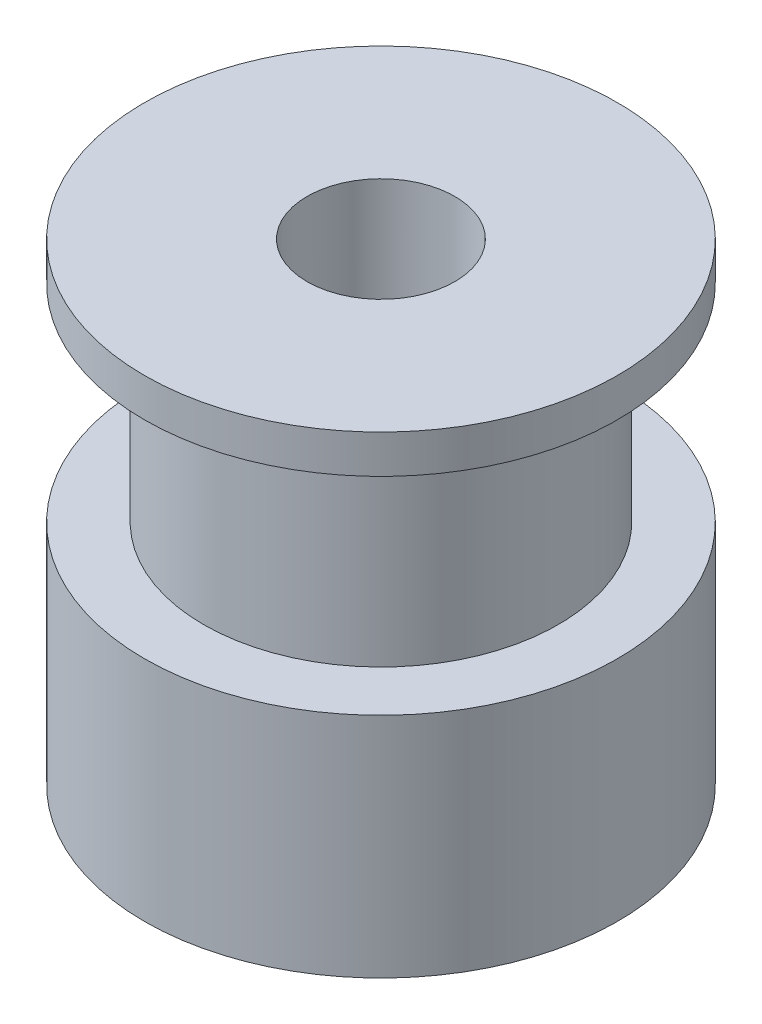
ISO-10303-21;
HEADER;
FILE_DESCRIPTION(('STEP AP214'),'2;1');
FILE_NAME('part.step','',(''),(''),'','','');
FILE_SCHEMA(('AUTOMOTIVE_DESIGN { 1 0 10303 214 1 1 1 1 }'));
ENDSEC;
DATA;
#1=APPLICATION_CONTEXT('core data for automotive mechanical design processes');
#2=APPLICATION_PROTOCOL_DEFINITION('international standard','automotive_design',2000,#1);
#3=PRODUCT_CONTEXT('',#1,'mechanical');
#4=PRODUCT('Part','Part','',(#3));
#5=PRODUCT_RELATED_PRODUCT_CATEGORY('part','',(#4));
#6=PRODUCT_DEFINITION_FORMATION('','',#4);
#7=PRODUCT_DEFINITION_CONTEXT('part definition',#1,'design');
#8=PRODUCT_DEFINITION('design','',#6,#7);
#9=PRODUCT_DEFINITION_SHAPE('','',#8);
#10=(LENGTH_UNIT() NAMED_UNIT(*) SI_UNIT(.MILLI.,.METRE.));
#11=(NAMED_UNIT(*) PLANE_ANGLE_UNIT() SI_UNIT($,.RADIAN.));
#12=(NAMED_UNIT(*) SI_UNIT($,.STERADIAN.) SOLID_ANGLE_UNIT());
#13=UNCERTAINTY_MEASURE_WITH_UNIT(LENGTH_MEASURE(1.E-05),#10,'distance_accuracy_value','');
#14=(GEOMETRIC_REPRESENTATION_CONTEXT(3) GLOBAL_UNCERTAINTY_ASSIGNED_CONTEXT((#13)) GLOBAL_UNIT_ASSIGNED_CONTEXT((#10,
#11,#12)) REPRESENTATION_CONTEXT('',''));
#15=CARTESIAN_POINT('',(0.,0.,0.));
#16=DIRECTION('',(0.,0.,1.));
#17=DIRECTION('',(1.,0.,0.));
#18=AXIS2_PLACEMENT_3D('',#15,#16,#17);
#19=CARTESIAN_POINT('',(0.,16.,0.));
#20=DIRECTION('',(0.,-1.,0.));
#21=DIRECTION('',(0.,0.,-1.));
#22=AXIS2_PLACEMENT_3D('',#19,#20,#21);
#23=CYLINDRICAL_SURFACE('',#22,8.);
#24=CARTESIAN_POINT('',(0.,5.25,-8.));
#25=CARTESIAN_POINT('',(-0.0862000090560729,5.24999676493766,-7.99999842280321));
#26=CARTESIAN_POINT('',(-0.172441514582273,5.24278495234733,-7.99859244950264));
#27=CARTESIAN_POINT('',(-0.342490617447966,5.21414895522089,-7.99311930778483));
#28=CARTESIAN_POINT('',(-0.426296161166576,5.19271312234083,-7.98904995831119));
#29=CARTESIAN_POINT('',(-0.58898979371781,5.13631307059479,-7.97870487543911));
#30=CARTESIAN_POINT('',(-0.667882377412848,5.10136143489223,-7.97243119476004));
#31=CARTESIAN_POINT('',(-0.818677267895579,5.01895847656759,-7.95836101466986));
#32=CARTESIAN_POINT('',(-0.890580066100288,4.97150803354579,-7.95056462242915));
#33=CARTESIAN_POINT('',(-1.02627735016224,4.86481267512939,-7.93419720784637));
#34=CARTESIAN_POINT('',(-1.08996986367006,4.80543925724322,-7.92561835612107));
#35=CARTESIAN_POINT('',(-1.20655602201014,4.6768596781906,-7.90871045383984));
#36=CARTESIAN_POINT('',(-1.25944885837716,4.60765278154584,-7.90038142202523));
#37=CARTESIAN_POINT('',(-1.35336324284205,4.46064378847068,-7.88483993293564));
#38=CARTESIAN_POINT('',(-1.39428014474202,4.38277368025028,-7.87763756031106));
#39=CARTESIAN_POINT('',(-1.46241103269185,4.22110152803017,-7.86527562393696));
#40=CARTESIAN_POINT('',(-1.48962628469253,4.1373000328716,-7.86011587147092));
#41=CARTESIAN_POINT('',(-1.52925220095506,3.96723801759727,-7.85250239060556));
#42=CARTESIAN_POINT('',(-1.54184123479366,3.88102054678682,-7.8500160874707));
#43=CARTESIAN_POINT('',(-1.55241119677996,3.70766408421109,-7.84793288411762));
#44=CARTESIAN_POINT('',(-1.55039352505241,3.62052518156913,-7.84833570696241));
#45=CARTESIAN_POINT('',(-1.53195177741558,3.44909792062467,-7.85195561402893));
#46=CARTESIAN_POINT('',(-1.51573133777978,3.36478669088638,-7.85513291659775));
#47=CARTESIAN_POINT('',(-1.46966555159002,3.20010528434397,-7.8638812199749));
#48=CARTESIAN_POINT('',(-1.43981959064031,3.119735285437,-7.86945232872297));
#49=CARTESIAN_POINT('',(-1.36715315209459,2.96462634241139,-7.88240165698288));
#50=CARTESIAN_POINT('',(-1.32425119437669,2.88992655226814,-7.88979116772949));
#51=CARTESIAN_POINT('',(-1.22674814971844,2.74870967304282,-7.90553732992767));
#52=CARTESIAN_POINT('',(-1.17214579787343,2.68219346989573,-7.9138940859011));
#53=CARTESIAN_POINT('',(-1.05169775923755,2.55805610673058,-7.93080599268302));
#54=CARTESIAN_POINT('',(-0.985678079341828,2.5006037678194,-7.93936211336833));
#55=CARTESIAN_POINT('',(-0.844849674944133,2.39756327596816,-7.95557947642291));
#56=CARTESIAN_POINT('',(-0.770040850625422,2.35197525778797,-7.96324070862712));
#57=CARTESIAN_POINT('',(-0.613575982254031,2.27392948945622,-7.97682216610372));
#58=CARTESIAN_POINT('',(-0.531910527300557,2.2414901539487,-7.98273994653887));
#59=CARTESIAN_POINT('',(-0.364149126216119,2.19083784635154,-7.99214900770227));
#60=CARTESIAN_POINT('',(-0.278053684371384,2.17262325879402,-7.99564056396557));
#61=CARTESIAN_POINT('',(-0.105327839677998,2.15117445702254,-7.99976566694373));
#62=CARTESIAN_POINT('',(-0.0187271634665335,2.14770906909094,-8.0004433137256));
#63=CARTESIAN_POINT('',(0.153815986945086,2.15523571508789,-7.99898639516866));
#64=CARTESIAN_POINT('',(0.239758495532299,2.16622698844903,-7.99685197777301));
#65=CARTESIAN_POINT('',(0.407806296409149,2.20216282211516,-7.99003828417804));
#66=CARTESIAN_POINT('',(0.489937723225352,2.22698959992518,-7.9853804987691));
#67=CARTESIAN_POINT('',(0.648872205621938,2.28976362843683,-7.97404029109996));
#68=CARTESIAN_POINT('',(0.725674880192193,2.32771181617161,-7.96735772424919));
#69=CARTESIAN_POINT('',(0.872752578183329,2.41615741881622,-7.95259926490459));
#70=CARTESIAN_POINT('',(0.942941710588083,2.46679506766572,-7.94450813353156));
#71=CARTESIAN_POINT('',(1.07390931417536,2.57899339889182,-7.92786761642387));
#72=CARTESIAN_POINT('',(1.13468684159778,2.64055517537205,-7.91931818484816));
#73=CARTESIAN_POINT('',(1.24599121245434,2.77390372044563,-7.90257717759425));
#74=CARTESIAN_POINT('',(1.29635982413073,2.84582356552242,-7.89439242829045));
#75=CARTESIAN_POINT('',(1.38430167523511,2.99723907995786,-7.87944838275179));
#76=CARTESIAN_POINT('',(1.4218754090806,3.07673445643215,-7.87268903144079));
#77=CARTESIAN_POINT('',(1.48294066253224,3.24065582775884,-7.86141544092826));
#78=CARTESIAN_POINT('',(1.50650270327786,3.32505474320863,-7.85688997843682));
#79=CARTESIAN_POINT('',(1.53909150160866,3.49671006272617,-7.85057181400503));
#80=CARTESIAN_POINT('',(1.54812002396802,3.58396611854436,-7.84877878027308));
#81=CARTESIAN_POINT('',(1.55132334850363,3.75727208165829,-7.84814610403893));
#82=CARTESIAN_POINT('',(1.5457479550327,3.8433172885347,-7.84925679188612));
#83=CARTESIAN_POINT('',(1.52045079539906,4.01321882488566,-7.85419586161266));
#84=CARTESIAN_POINT('',(1.50072912771435,4.09707516959355,-7.85802422457316));
#85=CARTESIAN_POINT('',(1.44780764189631,4.26007212648241,-7.867945727974));
#86=CARTESIAN_POINT('',(1.41463664120813,4.33922240899543,-7.87403402378802));
#87=CARTESIAN_POINT('',(1.33578606149655,4.49087372647452,-7.88779248725542));
#88=CARTESIAN_POINT('',(1.29010551674906,4.5633742475087,-7.89546277702584));
#89=CARTESIAN_POINT('',(1.18667159674349,4.70091569366497,-7.91167407868071));
#90=CARTESIAN_POINT('',(1.12873710362045,4.76581903052023,-7.92022703770621));
#91=CARTESIAN_POINT('',(1.00281570181795,4.88506582611932,-7.93715240007839));
#92=CARTESIAN_POINT('',(0.934826487245946,4.93940685593038,-7.94552476150182));
#93=CARTESIAN_POINT('',(0.789933072815975,5.03648234853805,-7.96124124716936));
#94=CARTESIAN_POINT('',(0.712948687376799,5.07909893576057,-7.96857459292986));
#95=CARTESIAN_POINT('',(0.552792962431646,5.15072404396555,-7.98128114701078));
#96=CARTESIAN_POINT('',(0.469627401220559,5.17974509348505,-7.98665615895217));
#97=CARTESIAN_POINT('',(0.321871061162894,5.21759630966608,-7.99376993370221));
#98=CARTESIAN_POINT('',(0.258133187842328,5.22972648752207,-7.99609278018456));
#99=CARTESIAN_POINT('',(0.129604676449405,5.24592943416533,-7.99920838449221));
#100=CARTESIAN_POINT('',(0.0648140684162283,5.25000243245394,-8.00000118589942));
#101=CARTESIAN_POINT('',(0.,5.25,-8.));
#102=B_SPLINE_CURVE_WITH_KNOTS('',3,(#24,#25,#26,#27,#28,#29,#30,#31,#32,#33,#34,#35,#36,#37,
#38,#39,#40,#41,#42,#43,#44,#45,#46,#47,#48,#49,#50,#51,#52,#53,#54,#55,#56,#57,#58,#59,#60,#61,
#62,#63,#64,#65,#66,#67,#68,#69,#70,#71,#72,#73,#74,#75,#76,#77,#78,#79,#80,#81,#82,#83,#84,#85,
#86,#87,#88,#89,#90,#91,#92,#93,#94,#95,#96,#97,#98,#99,#100,#101),.UNSPECIFIED.,.T.,.F.,(4,2,2,
2,2,2,2,2,2,2,2,2,2,2,2,2,2,2,2,2,2,2,2,2,2,2,2,2,2,2,2,2,2,2,2,2,2,2,4),(0.,0.258362958819541,
0.516937757947956,0.775272402208297,1.03358887109089,1.29485526419773,1.55614120857562,
1.81964642084703,2.08312728233678,2.34336004904479,2.6035678714891,2.86010487745127,
3.11665345220478,3.3748371276435,3.63304872886352,3.89561245181341,4.15817915694069,
4.42111232492289,4.68401562792029,4.94278274421266,5.20153624726778,5.45811989342286,
5.71472186665191,5.97429534799387,6.23389484154964,6.49718968196383,6.76047434702859,
7.02242242662094,7.2843386960156,7.54180418298674,7.79926787765263,8.05618280428258,
8.31311757007748,8.57415474091679,8.83525186963594,9.09888533019473,9.36227536746884,
9.55654485391842,9.75080880670125),.UNSPECIFIED.);
#103=CARTESIAN_POINT('',(0.,5.25,-8.));
#104=VERTEX_POINT('',#103);
#105=EDGE_CURVE('E60',#104,#104,#102,.T.);
#106=ORIENTED_EDGE('',*,*,#105,.T.);
#107=EDGE_LOOP('',(#106));
#108=FACE_BOUND('',#107,.T.);
#109=CARTESIAN_POINT('',(-7.84840748177616,3.7,1.55));
#110=CARTESIAN_POINT('',(-7.84840917479428,3.61381710885319,1.54999675153501));
#111=CARTESIAN_POINT('',(-7.84984246006417,3.52759268456474,1.54278770606264));
#112=CARTESIAN_POINT('',(-7.85541296965903,3.35757905066934,1.51416369588475));
#113=CARTESIAN_POINT('',(-7.85955242355985,3.27379190861179,1.49273701724449));
#114=CARTESIAN_POINT('',(-7.87004925058474,3.11113724367693,1.43636372934191));
#115=CARTESIAN_POINT('',(-7.876404488281,3.03226507003024,1.40143013364525));
#116=CARTESIAN_POINT('',(-7.89061427460669,2.88150457537131,1.31906969778675));
#117=CARTESIAN_POINT('',(-7.89846872268518,2.80961578647624,1.27164369540043));
#118=CARTESIAN_POINT('',(-7.91490844635351,2.6739035056575,1.16497337071828));
#119=CARTESIAN_POINT('',(-7.92350130996113,2.61018623275839,1.10559505882221));
#120=CARTESIAN_POINT('',(-7.94038276237089,2.49355205350519,0.976995189429632));
#121=CARTESIAN_POINT('',(-7.94867133050778,2.4406358795649,0.907772964965019));
#122=CARTESIAN_POINT('',(-7.96409185638153,2.34669642213338,0.760749728565109));
#123=CARTESIAN_POINT('',(-7.9712138273046,2.30577367820002,0.682883340378193));
#124=CARTESIAN_POINT('',(-7.98341362003513,2.23763097409406,0.521219238216924));
#125=CARTESIAN_POINT('',(-7.98849162132962,2.21040981069243,0.437422045804264));
#126=CARTESIAN_POINT('',(-7.99597772018769,2.17077252082889,0.267376556287115));
#127=CARTESIAN_POINT('',(-7.99841811077838,2.15817718064698,0.181171478825116));
#128=CARTESIAN_POINT('',(-8.00046543898589,2.14759030731567,0.0078395306383784));
#129=CARTESIAN_POINT('',(-8.00007263352152,2.14959744998963,-0.0792872557888458));
#130=CARTESIAN_POINT('',(-7.99652295935206,2.16802186946111,-0.250759179993092));
#131=CARTESIAN_POINT('',(-7.99340311295795,2.18424614186176,-0.335125933339361));
#132=CARTESIAN_POINT('',(-7.98479153905603,2.23033858777597,-0.499916379098675));
#133=CARTESIAN_POINT('',(-7.9792997208631,2.26020728294496,-0.58033992062412));
#134=CARTESIAN_POINT('',(-7.96649981100649,2.33292209527985,-0.735516295161441));
#135=CARTESIAN_POINT('',(-7.95918107415875,2.37584460699432,-0.810232416142011));
#136=CARTESIAN_POINT('',(-7.94353544535097,2.47339223335338,-0.951473377606903));
#137=CARTESIAN_POINT('',(-7.93520844425002,2.52801861539241,-1.01799732974407));
#138=CARTESIAN_POINT('',(-7.918306541966,2.64848456960064,-1.14211004187946));
#139=CARTESIAN_POINT('',(-7.90972981400609,2.71449302628265,-1.19953474929202));
#140=CARTESIAN_POINT('',(-7.89342488450323,2.85528883907341,-1.30252471835069));
#141=CARTESIAN_POINT('',(-7.88569669710255,2.93007634145586,-1.34808978235445));
#142=CARTESIAN_POINT('',(-7.87196073542997,3.08653371042869,-1.42611862268724));
#143=CARTESIAN_POINT('',(-7.86595627357848,3.16821644286062,-1.45855722269684));
#144=CARTESIAN_POINT('',(-7.85639724526608,3.33601564307211,-1.50920284925151));
#145=CARTESIAN_POINT('',(-7.85284238080886,3.42213157017819,-1.52741160690931));
#146=CARTESIAN_POINT('',(-7.84864436792988,3.59486959474718,-1.54883836082157));
#147=CARTESIAN_POINT('',(-7.84795532864622,3.68146129843951,-1.55229264697998));
#148=CARTESIAN_POINT('',(-7.84944399184972,3.85398390799386,-1.54474700341671));
#149=CARTESIAN_POINT('',(-7.85162154238006,3.93991484863979,-1.53374783986684));
#150=CARTESIAN_POINT('',(-7.85855517055887,4.10789129001674,-1.49781079738529));
#151=CARTESIAN_POINT('',(-7.86328810516769,4.1899645840678,-1.47299796126197));
#152=CARTESIAN_POINT('',(-7.87477910573104,4.34878891282538,-1.4102710989445));
#153=CARTESIAN_POINT('',(-7.88153732966491,4.42553953177011,-1.37235605069857));
#154=CARTESIAN_POINT('',(-7.89642123891477,4.57257735252873,-1.28396161175264));
#155=CARTESIAN_POINT('',(-7.90456269734265,4.64277361099191,-1.23333365024262));
#156=CARTESIAN_POINT('',(-7.92125191031692,4.77376004721999,-1.12114973376264));
#157=CARTESIAN_POINT('',(-7.92979970393077,4.83454931814071,-1.05959272644712));
#158=CARTESIAN_POINT('',(-7.94648666010914,4.94588542009488,-0.9262400837038));
#159=CARTESIAN_POINT('',(-7.9546182074806,4.99627291639543,-0.854310314560684));
#160=CARTESIAN_POINT('',(-7.96942624259837,5.08424786235766,-0.702869300885619));
#161=CARTESIAN_POINT('',(-7.97610278894229,5.12183582753241,-0.623358361857509));
#162=CARTESIAN_POINT('',(-7.9872159211584,5.18290929219913,-0.45944172661069));
#163=CARTESIAN_POINT('',(-7.99166465460796,5.2064714062558,-0.375065436031682));
#164=CARTESIAN_POINT('',(-7.9978728695116,5.23906799321239,-0.203458346295077));
#165=CARTESIAN_POINT('',(-7.99963265402342,5.24810410327028,-0.116227869950291));
#166=CARTESIAN_POINT('',(-8.00025810359313,5.2513320219734,0.0570864432622315));
#167=CARTESIAN_POINT('',(-7.99917058136277,5.2457639362274,0.14316573047771));
#168=CARTESIAN_POINT('',(-7.99432145369819,5.22046949834751,0.313137375692122));
#169=CARTESIAN_POINT('',(-7.99055987773605,5.20074330225721,0.397029757783468));
#170=CARTESIAN_POINT('',(-7.98078593726139,5.14779653382766,0.560108090189464));
#171=CARTESIAN_POINT('',(-7.97477810886306,5.11460314590338,0.639303155389725));
#172=CARTESIAN_POINT('',(-7.96116030489722,5.03569376971635,0.791034873243722));
#173=CARTESIAN_POINT('',(-7.95355021238711,4.98997686734092,0.863571039336852));
#174=CARTESIAN_POINT('',(-7.9374200715008,4.88649985414121,1.00111787201507));
#175=CARTESIAN_POINT('',(-7.92888794058911,4.82856710073675,1.06599725682603));
#176=CARTESIAN_POINT('',(-7.91194936427255,4.70265942754123,1.18519653435066));
#177=CARTESIAN_POINT('',(-7.90354294899311,4.63468214191662,1.23951393235294));
#178=CARTESIAN_POINT('',(-7.88771547822441,4.48980129027953,1.33656014808014));
#179=CARTESIAN_POINT('',(-7.8803051069193,4.41281532516238,1.37916775875614));
#180=CARTESIAN_POINT('',(-7.86743823169497,4.25265701516467,1.45077566413727));
#181=CARTESIAN_POINT('',(-7.86197991983782,4.16949048123237,1.47978855762294));
#182=CARTESIAN_POINT('',(-7.85474947273195,4.02175513704729,1.51761979973136));
#183=CARTESIAN_POINT('',(-7.8523856510816,3.95804053175902,1.52974111642604));
#184=CARTESIAN_POINT('',(-7.84921404305856,3.82955842065378,1.54593231424017));
#185=CARTESIAN_POINT('',(-7.84840620899166,3.76479094717075,1.55000244214508));
#186=CARTESIAN_POINT('',(-7.84840748177616,3.7,1.55));
#187=B_SPLINE_CURVE_WITH_KNOTS('',3,(#109,#110,#111,#112,#113,#114,#115,#116,#117,#118,#119,
#120,#121,#122,#123,#124,#125,#126,#127,#128,#129,#130,#131,#132,#133,#134,#135,#136,#137,#138,
#139,#140,#141,#142,#143,#144,#145,#146,#147,#148,#149,#150,#151,#152,#153,#154,#155,#156,#157,
#158,#159,#160,#161,#162,#163,#164,#165,#166,#167,#168,#169,#170,#171,#172,#173,#174,#175,#176,
#177,#178,#179,#180,#181,#182,#183,#184,#185,#186),.UNSPECIFIED.,.T.,.F.,(4,2,2,2,2,2,2,2,2,2,2,
2,2,2,2,2,2,2,2,2,2,2,2,2,2,2,2,2,2,2,2,2,2,2,2,2,2,2,4),(0.,0.258311508366331,
0.516836104764681,0.775112237591959,1.03337105411172,1.29470478354744,1.5560562279295,
1.81953968784894,2.08300000545414,2.34319683111846,2.6033700620101,2.86006509855315,
3.1167699499172,3.37500700149728,3.63327203132395,3.89576385125344,4.15826004535968,
4.42125734290794,4.68422264088331,4.94296043106421,5.20168450620739,5.45810379551815,
5.71454309160106,5.97413142285405,6.23374476314563,6.49708004265092,6.76040471482704,
7.02227748400138,7.28412073665109,7.54168614859525,7.79924872182606,8.0562939543786,
8.31335795410265,8.57433290394459,8.83536942065399,9.09901402686011,9.36241381721841,
9.55661431448052,9.75080885900619),.UNSPECIFIED.);
#188=CARTESIAN_POINT('',(-7.84840748177616,3.7,1.55));
#189=VERTEX_POINT('',#188);
#190=EDGE_CURVE('E59',#189,#189,#187,.T.);
#191=ORIENTED_EDGE('',*,*,#190,.T.);
#192=EDGE_LOOP('',(#191));
#193=FACE_BOUND('',#192,.T.);
#194=CARTESIAN_POINT('',(0.,7.7,0.));
#195=DIRECTION('',(0.,1.,0.));
#196=DIRECTION('',(0.,0.,1.));
#197=AXIS2_PLACEMENT_3D('',#194,#195,#196);
#198=CIRCLE('',#197,8.);
#199=CARTESIAN_POINT('',(0.,7.7,8.));
#200=VERTEX_POINT('',#199);
#201=EDGE_CURVE('E92',#200,#200,#198,.T.);
#202=ORIENTED_EDGE('',*,*,#201,.F.);
#203=EDGE_LOOP('',(#202));
#204=FACE_BOUND('',#203,.T.);
#205=CARTESIAN_POINT('',(0.,0.,0.));
#206=DIRECTION('',(0.,1.,0.));
#207=DIRECTION('',(0.,0.,1.));
#208=AXIS2_PLACEMENT_3D('',#205,#206,#207);
#209=CIRCLE('',#208,8.);
#210=CARTESIAN_POINT('',(0.,0.,8.));
#211=VERTEX_POINT('',#210);
#212=EDGE_CURVE('E44',#211,#211,#209,.T.);
#213=ORIENTED_EDGE('',*,*,#212,.T.);
#214=EDGE_LOOP('',(#213));
#215=FACE_BOUND('',#214,.T.);
#216=ADVANCED_FACE('F31',(#108,#193,#204,#215),#23,.T.);
#217=CARTESIAN_POINT('',(0.,16.,0.));
#218=DIRECTION('',(0.,1.,0.));
#219=DIRECTION('',(0.,0.,1.));
#220=AXIS2_PLACEMENT_3D('',#217,#218,#219);
#221=PLANE('',#220);
#222=CARTESIAN_POINT('',(0.,16.,0.));
#223=DIRECTION('',(0.,1.,0.));
#224=DIRECTION('',(0.,0.,1.));
#225=AXIS2_PLACEMENT_3D('',#222,#223,#224);
#226=CIRCLE('',#225,8.);
#227=CARTESIAN_POINT('',(0.,16.,8.));
#228=VERTEX_POINT('',#227);
#229=EDGE_CURVE('E10',#228,#228,#226,.T.);
#230=ORIENTED_EDGE('',*,*,#229,.T.);
#231=EDGE_LOOP('',(#230));
#232=FACE_BOUND('',#231,.T.);
#233=CARTESIAN_POINT('',(0.,16.,0.));
#234=DIRECTION('',(0.,1.,0.));
#235=DIRECTION('',(0.,0.,1.));
#236=AXIS2_PLACEMENT_3D('',#233,#234,#235);
#237=CIRCLE('',#236,2.5);
#238=CARTESIAN_POINT('',(0.,16.,2.5));
#239=VERTEX_POINT('',#238);
#240=EDGE_CURVE('E49',#239,#239,#237,.T.);
#241=ORIENTED_EDGE('',*,*,#240,.F.);
#242=EDGE_LOOP('',(#241));
#243=FACE_BOUND('',#242,.T.);
#244=ADVANCED_FACE('F116',(#232,#243),#221,.T.);
#245=CARTESIAN_POINT('',(0.,0.,0.));
#246=DIRECTION('',(0.,1.,0.));
#247=DIRECTION('',(0.,0.,1.));
#248=AXIS2_PLACEMENT_3D('',#245,#246,#247);
#249=PLANE('',#248);
#250=ORIENTED_EDGE('',*,*,#212,.F.);
#251=EDGE_LOOP('',(#250));
#252=FACE_BOUND('',#251,.T.);
#253=CARTESIAN_POINT('',(0.,0.,0.));
#254=DIRECTION('',(0.,1.,0.));
#255=DIRECTION('',(0.,0.,1.));
#256=AXIS2_PLACEMENT_3D('',#253,#254,#255);
#257=CIRCLE('',#256,2.5);
#258=CARTESIAN_POINT('',(0.,0.,2.5));
#259=VERTEX_POINT('',#258);
#260=EDGE_CURVE('E52',#259,#259,#257,.T.);
#261=ORIENTED_EDGE('',*,*,#260,.T.);
#262=EDGE_LOOP('',(#261));
#263=FACE_BOUND('',#262,.T.);
#264=ADVANCED_FACE('F100',(#252,#263),#249,.F.);
#265=CARTESIAN_POINT('',(0.,14.7,0.));
#266=DIRECTION('',(0.,1.,0.));
#267=DIRECTION('',(0.,0.,1.));
#268=AXIS2_PLACEMENT_3D('',#265,#266,#267);
#269=CIRCLE('',#268,8.);
#270=CARTESIAN_POINT('',(0.,14.7,8.));
#271=VERTEX_POINT('',#270);
#272=EDGE_CURVE('E81',#271,#271,#269,.T.);
#273=ORIENTED_EDGE('',*,*,#272,.T.);
#274=EDGE_LOOP('',(#273));
#275=FACE_BOUND('',#274,.T.);
#276=ORIENTED_EDGE('',*,*,#229,.F.);
#277=EDGE_LOOP('',(#276));
#278=FACE_BOUND('',#277,.T.);
#279=ADVANCED_FACE('F33',(#275,#278),#23,.T.);
#280=CARTESIAN_POINT('',(0.,16.,0.));
#281=DIRECTION('',(0.,-1.,0.));
#282=DIRECTION('',(0.,0.,-1.));
#283=AXIS2_PLACEMENT_3D('',#280,#281,#282);
#284=CYLINDRICAL_SURFACE('',#283,2.5);
#285=CARTESIAN_POINT('',(0.,5.25,-2.5));
#286=CARTESIAN_POINT('',(-0.0788588437032426,5.24999376307353,-2.49999429187124));
#287=CARTESIAN_POINT('',(-0.157821332634414,5.24394032971213,-2.4962290419934));
#288=CARTESIAN_POINT('',(-0.313332399319532,5.22004633078672,-2.48152288773695));
#289=CARTESIAN_POINT('',(-0.38987576869253,5.2021819365279,-2.47056747748772));
#290=CARTESIAN_POINT('',(-0.537988785014462,5.15570033140678,-2.44258502314196));
#291=CARTESIAN_POINT('',(-0.609581021036303,5.12713638226537,-2.42558807451069));
#292=CARTESIAN_POINT('',(-0.746713058811779,5.0604192435479,-2.3869441453313));
#293=CARTESIAN_POINT('',(-0.812253690448943,5.02226737148514,-2.36529780373345));
#294=CARTESIAN_POINT('',(-0.941293884097183,4.93411809813863,-2.31712659322814));
#295=CARTESIAN_POINT('',(-1.00422064688427,4.88342182814934,-2.29035112073073));
#296=CARTESIAN_POINT('',(-1.1212350973568,4.77322123234472,-2.23540162410815));
#297=CARTESIAN_POINT('',(-1.17531081014314,4.71370517787167,-2.20722577141734));
#298=CARTESIAN_POINT('',(-1.28039375860723,4.57828593831737,-2.14818115491673));
#299=CARTESIAN_POINT('',(-1.33003925885999,4.50125613898113,-2.11745183429643));
#300=CARTESIAN_POINT('',(-1.41552497113684,4.338145528989,-2.06128924667063));
#301=CARTESIAN_POINT('',(-1.45138834413738,4.25208021531495,-2.03584712782502));
#302=CARTESIAN_POINT('',(-1.50026402694741,4.09571989114142,-1.99997050177168));
#303=CARTESIAN_POINT('',(-1.5167746289236,4.02702027972485,-1.98736196780876));
#304=CARTESIAN_POINT('',(-1.54028947037061,3.88713838422103,-1.96919702589758));
#305=CARTESIAN_POINT('',(-1.54730680164645,3.81595965831553,-1.96363090671341));
#306=CARTESIAN_POINT('',(-1.55141788986712,3.67295217691596,-1.96038556839994));
#307=CARTESIAN_POINT('',(-1.54848704891597,3.60112224879033,-1.96272589872652));
#308=CARTESIAN_POINT('',(-1.53284412094561,3.4591745962167,-1.97496355211978));
#309=CARTESIAN_POINT('',(-1.52012428241025,3.38905827412448,-1.9848668639617));
#310=CARTESIAN_POINT('',(-1.48598267203115,3.25376090402609,-2.0105456964276));
#311=CARTESIAN_POINT('',(-1.46474648443675,3.1885077391289,-2.02619541620058));
#312=CARTESIAN_POINT('',(-1.41439694127178,3.0623477361912,-2.06165648201752));
#313=CARTESIAN_POINT('',(-1.38528078195598,3.00144245492254,-2.08146930875989));
#314=CARTESIAN_POINT('',(-1.313820464675,2.87376067031125,-2.12743819010699));
#315=CARTESIAN_POINT('',(-1.27002687148206,2.80797409613913,-2.15409014025284));
#316=CARTESIAN_POINT('',(-1.17319244997812,2.6839694681584,-2.20832654858739));
#317=CARTESIAN_POINT('',(-1.12014223269971,2.62575920466189,-2.23591193043098));
#318=CARTESIAN_POINT('',(-0.996286960635267,2.50909529179813,-2.29408009636508));
#319=CARTESIAN_POINT('',(-0.923999532007088,2.45208565979179,-2.32443856839691));
#320=CARTESIAN_POINT('',(-0.769086757587359,2.3510972830411,-2.38018243982508));
#321=CARTESIAN_POINT('',(-0.68646583999846,2.30711298358872,-2.40556995753639));
#322=CARTESIAN_POINT('',(-0.517721208332049,2.23632223853395,-2.44726008999535));
#323=CARTESIAN_POINT('',(-0.432055246314869,2.20868937509957,-2.4639930629249));
#324=CARTESIAN_POINT('',(-0.256034297731914,2.16864080240635,-2.48843390571255));
#325=CARTESIAN_POINT('',(-0.165685915020279,2.15620423876626,-2.49615414339251));
#326=CARTESIAN_POINT('',(0.00276935564960071,2.14805200646952,-2.50120784313496));
#327=CARTESIAN_POINT('',(0.0807390600254808,2.15016150437549,-2.49989239008237));
#328=CARTESIAN_POINT('',(0.235031263662723,2.16596283288028,-2.49012655813649));
#329=CARTESIAN_POINT('',(0.311353856738507,2.17965400202753,-2.48167658670933));
#330=CARTESIAN_POINT('',(0.457489712798822,2.21719988314723,-2.45885841340398));
#331=CARTESIAN_POINT('',(0.527438357904755,2.24067139879034,-2.4447139643625));
#332=CARTESIAN_POINT('',(0.66234412276202,2.29673927503794,-2.41166510349799));
#333=CARTESIAN_POINT('',(0.727300378044071,2.32933721143312,-2.39275986972265));
#334=CARTESIAN_POINT('',(0.857544402062975,2.40639532321067,-2.34942434439012));
#335=CARTESIAN_POINT('',(0.922193940250683,2.45172477612912,-2.32462767485861));
#336=CARTESIAN_POINT('',(1.04343139506677,2.55112753111915,-2.27279737203162));
#337=CARTESIAN_POINT('',(1.10001009319858,2.60521068356147,-2.24576123563856));
#338=CARTESIAN_POINT('',(1.21184039554583,2.72948743007143,-2.18768164007204));
#339=CARTESIAN_POINT('',(1.26575645315799,2.80087843650117,-2.15661561782996));
#340=CARTESIAN_POINT('',(1.36099683780066,2.95286302695704,-2.09781350295615));
#341=CARTESIAN_POINT('',(1.40233088983087,3.03344943700589,-2.070074848605));
#342=CARTESIAN_POINT('',(1.46357061135418,3.18461019566889,-2.02708066177371));
#343=CARTESIAN_POINT('',(1.48616002718022,3.25369356093437,-2.01042564623887));
#344=CARTESIAN_POINT('',(1.52155082835618,3.39552321076517,-1.98377958126586));
#345=CARTESIAN_POINT('',(1.53436721830412,3.46826369673628,-1.97377831929464));
#346=CARTESIAN_POINT('',(1.54950294177108,3.61591210566903,-1.96192300649029));
#347=CARTESIAN_POINT('',(1.55176669925662,3.69082941770692,-1.96011209206832));
#348=CARTESIAN_POINT('',(1.54547411737237,3.83993497383357,-1.96507571506743));
#349=CARTESIAN_POINT('',(1.53691357855984,3.91412292369985,-1.97185358463406));
#350=CARTESIAN_POINT('',(1.51057652512254,4.05406008488436,-1.99208480393457));
#351=CARTESIAN_POINT('',(1.4935251218414,4.12002840902801,-2.0050097980916));
#352=CARTESIAN_POINT('',(1.45140966225522,4.24814467549398,-2.03570290194589));
#353=CARTESIAN_POINT('',(1.42634236984808,4.31029106275617,-2.05347296722367));
#354=CARTESIAN_POINT('',(1.36469434717776,4.43886058119075,-2.09503744314059));
#355=CARTESIAN_POINT('',(1.32696197451469,4.50456660858769,-2.11933360202007));
#356=CARTESIAN_POINT('',(1.24276682308932,4.62935781878306,-2.169779816375));
#357=CARTESIAN_POINT('',(1.19629689668291,4.68843751737706,-2.19593137865586));
#358=CARTESIAN_POINT('',(1.0855682064216,4.80996554428945,-2.25302429895376));
#359=CARTESIAN_POINT('',(1.01960703796191,4.87089768122217,-2.2839253041148));
#360=CARTESIAN_POINT('',(0.877161497537548,4.9810952082253,-2.34233334998147));
#361=CARTESIAN_POINT('',(0.800671254618157,5.03035404732952,-2.36983848082066));
#362=CARTESIAN_POINT('',(0.638938712934247,5.11510106599765,-2.41843091326597));
#363=CARTESIAN_POINT('',(0.553746127625814,5.1506624773551,-2.43955221086063));
#364=CARTESIAN_POINT('',(0.421301099817821,5.19236527140187,-2.46465774407334));
#365=CARTESIAN_POINT('',(0.376422189029318,5.20432038499889,-2.47192634059725));
#366=CARTESIAN_POINT('',(0.285474041444572,5.22419301092254,-2.48406936079425));
#367=CARTESIAN_POINT('',(0.239405733893815,5.23211358069111,-2.48894559733253));
#368=CARTESIAN_POINT('',(0.161047989173955,5.2419470631308,-2.49501329928392));
#369=CARTESIAN_POINT('',(0.128943745626345,5.24496332550078,-2.49687972924314));
#370=CARTESIAN_POINT('',(0.0645654678378658,5.24899113191465,-2.49937428598552));
#371=CARTESIAN_POINT('',(0.0322914233808325,5.2500025539207,-2.50000233738657));
#372=CARTESIAN_POINT('',(0.,5.25,-2.5));
#373=B_SPLINE_CURVE_WITH_KNOTS('',3,(#285,#286,#287,#288,#289,#290,#291,#292,#293,#294,#295,
#296,#297,#298,#299,#300,#301,#302,#303,#304,#305,#306,#307,#308,#309,#310,#311,#312,#313,#314,
#315,#316,#317,#318,#319,#320,#321,#322,#323,#324,#325,#326,#327,#328,#329,#330,#331,#332,#333,
#334,#335,#336,#337,#338,#339,#340,#341,#342,#343,#344,#345,#346,#347,#348,#349,#350,#351,#352,
#353,#354,#355,#356,#357,#358,#359,#360,#361,#362,#363,#364,#365,#366,#367,#368,#369,#370,#371,
#372),.UNSPECIFIED.,.T.,.F.,(4,2,2,2,2,2,2,2,2,2,2,2,2,2,2,2,2,2,2,2,2,2,2,2,2,2,2,2,2,2,2,2,2,
2,2,2,2,2,2,2,2,2,2,4),(0.,0.236446228457157,0.473370950460776,0.709131619466242,
0.944859909390716,1.19925851976264,1.45399851983806,1.7425763364641,2.03066705263116,
2.24508582188167,2.45920859197792,2.67386118829384,2.88868393454209,3.09905975901316,
3.30951053520468,3.55878870184927,3.80832119620305,4.09768071773994,4.38691666239603,
4.65989886577402,4.93250602443849,5.16534001465539,5.39816070817221,5.62260894018461,
5.84709594991739,6.09441520669313,6.34201472709113,6.62486218442198,6.90749046229385,
7.13029917881917,7.35276512289026,7.57640138258052,7.80012443182876,8.00737199532242,
8.21470333277814,8.4525547674591,8.69060162671803,8.97416887566528,9.25789488553315,
9.54008220302288,9.68090486713808,9.82162065421911,9.91843567442451,10.0152565877344),.UNSPECIFIED.);
#374=CARTESIAN_POINT('',(0.,5.25,-2.5));
#375=VERTEX_POINT('',#374);
#376=EDGE_CURVE('E36',#375,#375,#373,.T.);
#377=ORIENTED_EDGE('',*,*,#376,.F.);
#378=EDGE_LOOP('',(#377));
#379=FACE_BOUND('',#378,.T.);
#380=CARTESIAN_POINT('',(-1.9615045245933,3.7,1.55));
#381=CARTESIAN_POINT('',(-1.96151424870104,3.62281138785481,1.54999378053689));
#382=CARTESIAN_POINT('',(-1.96614557382882,3.5454953953879,1.54418156186051));
#383=CARTESIAN_POINT('',(-1.9838633900271,3.3934502755803,1.52134108403625));
#384=CARTESIAN_POINT('',(-1.99697365294463,3.31872904553537,1.50428128816676));
#385=CARTESIAN_POINT('',(-2.0294601197973,3.17453556056904,1.46014635903077));
#386=CARTESIAN_POINT('',(-2.04878260026202,3.10502438535091,1.4331568196176));
#387=CARTESIAN_POINT('',(-2.0914239040026,2.97160495685289,1.37017871186179));
#388=CARTESIAN_POINT('',(-2.11474271928946,2.90769669237274,1.33419016150882));
#389=CARTESIAN_POINT('',(-2.16645646466532,2.77803338901385,1.24870950446664));
#390=CARTESIAN_POINT('',(-2.19511540269679,2.71314437149462,1.1980629929912));
#391=CARTESIAN_POINT('',(-2.25215425532264,2.59205076838061,1.08706120616432));
#392=CARTESIAN_POINT('',(-2.28053390980231,2.53585367147609,1.02669764926841));
#393=CARTESIAN_POINT('',(-2.33778046966058,2.42716984066374,0.889350188695491));
#394=CARTESIAN_POINT('',(-2.36630963043383,2.37590364180245,0.81124555496123));
#395=CARTESIAN_POINT('',(-2.41680070946013,2.28764893069296,0.645413473261288));
#396=CARTESIAN_POINT('',(-2.43876903629854,2.25064647535831,0.55769553079599));
#397=CARTESIAN_POINT('',(-2.47167893587018,2.19596476505236,0.384422972942389));
#398=CARTESIAN_POINT('',(-2.48350627846964,2.17671822131419,0.299535669412866));
#399=CARTESIAN_POINT('',(-2.49826692421039,2.15276647503243,0.127003674696558));
#400=CARTESIAN_POINT('',(-2.50120937317764,2.14804631939234,0.0393619128538004));
#401=CARTESIAN_POINT('',(-2.49809230992567,2.15307979513079,-0.123678987087689));
#402=CARTESIAN_POINT('',(-2.49317090626151,2.16100333118845,-0.199165597693397));
#403=CARTESIAN_POINT('',(-2.47685576225816,2.18757649359508,-0.34749235228306));
#404=CARTESIAN_POINT('',(-2.46546153263042,2.20622693080452,-0.420332295759404));
#405=CARTESIAN_POINT('',(-2.43713069196735,2.25346517451238,-0.561802920355813));
#406=CARTESIAN_POINT('',(-2.42017614554279,2.28208515765705,-0.630419115172693));
#407=CARTESIAN_POINT('',(-2.38204725625026,2.34819471210059,-0.761935151090557));
#408=CARTESIAN_POINT('',(-2.36087192617611,2.3856863587924,-0.824833649849288));
#409=CARTESIAN_POINT('',(-2.31297395040609,2.47367303648542,-0.951461992788706));
#410=CARTESIAN_POINT('',(-2.28588918454719,2.52520213119493,-1.01433525204549));
#411=CARTESIAN_POINT('',(-2.23043110096469,2.63713191712316,-1.13109037374558));
#412=CARTESIAN_POINT('',(-2.2020559743937,2.69754534502471,-1.18495908623704));
#413=CARTESIAN_POINT('',(-2.1429182345191,2.83460587333307,-1.28915668394797));
#414=CARTESIAN_POINT('',(-2.11231310964065,2.91234077602232,-1.33815632994535));
#415=CARTESIAN_POINT('',(-2.05667767990901,3.07681396035955,-1.42219070772586));
#416=CARTESIAN_POINT('',(-2.03163711399847,3.16353523057948,-1.45725123911118));
#417=CARTESIAN_POINT('',(-1.99681385920609,3.32052638633492,-1.50444702320462));
#418=CARTESIAN_POINT('',(-1.98475675616393,3.38920988506934,-1.52017298393714));
#419=CARTESIAN_POINT('',(-1.96773803976764,3.52890302266688,-1.54214392766336));
#420=CARTESIAN_POINT('',(-1.96276703285156,3.59990945412242,-1.54840146299123));
#421=CARTESIAN_POINT('',(-1.96066654459021,3.74237526654645,-1.55106122738863));
#422=CARTESIAN_POINT('',(-1.96355347298903,3.81383528400117,-1.54744283248747));
#423=CARTESIAN_POINT('',(-1.97674871286604,3.95492119356789,-1.53054655558815));
#424=CARTESIAN_POINT('',(-1.98706312856595,4.02454552821941,-1.51726072839305));
#425=CARTESIAN_POINT('',(-2.01349354433852,4.15932567707063,-1.48199694702342));
#426=CARTESIAN_POINT('',(-2.02953123118546,4.22452831629352,-1.46013594726538));
#427=CARTESIAN_POINT('',(-2.06567447522356,4.35050775751608,-1.40853800244741));
#428=CARTESIAN_POINT('',(-2.08578149025177,4.4112829627456,-1.37879823363475));
#429=CARTESIAN_POINT('',(-2.13236966195419,4.53884793355636,-1.30583485655882));
#430=CARTESIAN_POINT('',(-2.15933780591821,4.60461069145196,-1.26112609457938));
#431=CARTESIAN_POINT('',(-2.21405897671811,4.72841786799942,-1.16238388123607));
#432=CARTESIAN_POINT('',(-2.24181278318815,4.78645426898311,-1.10834087521178));
#433=CARTESIAN_POINT('',(-2.30000071764024,4.90224001538029,-0.9825982076127));
#434=CARTESIAN_POINT('',(-2.33018968748089,4.95856963468927,-0.909461153690875));
#435=CARTESIAN_POINT('',(-2.38537108356641,5.05801466249098,-0.752912640658554));
#436=CARTESIAN_POINT('',(-2.41036618118433,5.1011368694106,-0.669506498596039));
#437=CARTESIAN_POINT('',(-2.45094902358919,5.16981922638324,-0.499957930928676));
#438=CARTESIAN_POINT('',(-2.46702888301674,5.19631203124967,-0.414316093777691));
#439=CARTESIAN_POINT('',(-2.49015690205228,5.23414847586493,-0.238607474980741));
#440=CARTESIAN_POINT('',(-2.49721708313487,5.2455122804775,-0.148546749548092));
#441=CARTESIAN_POINT('',(-2.50112707947154,5.25181670064362,0.0192407920026077));
#442=CARTESIAN_POINT('',(-2.49930744667249,5.24889732494797,0.0968650458125032));
#443=CARTESIAN_POINT('',(-2.48862410717513,5.23159958068243,0.250321956776388));
#444=CARTESIAN_POINT('',(-2.47976062601083,5.21722157900143,0.326154671212873));
#445=CARTESIAN_POINT('',(-2.45618356365155,5.17836608200072,0.471629496907221));
#446=CARTESIAN_POINT('',(-2.44165799200661,5.15421229142186,0.541390201956638));
#447=CARTESIAN_POINT('',(-2.40791840364487,5.09682106807057,0.675823330993717));
#448=CARTESIAN_POINT('',(-2.38870355613353,5.06358202554733,0.740494850647278));
#449=CARTESIAN_POINT('',(-2.34473975617865,4.98509626447414,0.87026927130808));
#450=CARTESIAN_POINT('',(-2.31962153159808,4.93895508360858,0.934704158335909));
#451=CARTESIAN_POINT('',(-2.26726405712508,4.83791668487189,1.05539147141775));
#452=CARTESIAN_POINT('',(-2.24002240411427,4.78300947049397,1.11163441390064));
#453=CARTESIAN_POINT('',(-2.18170907157317,4.65703133914615,1.22253718183677));
#454=CARTESIAN_POINT('',(-2.15063883617499,4.5847729705115,1.27585613556453));
#455=CARTESIAN_POINT('',(-2.09210043371895,4.43103535343923,1.36973708369424));
#456=CARTESIAN_POINT('',(-2.06463004271832,4.34956185652625,1.41030697618811));
#457=CARTESIAN_POINT('',(-2.02265873055881,4.19772207505244,1.46964948366814));
#458=CARTESIAN_POINT('',(-2.00663302998875,4.1288866596705,1.49125879976657));
#459=CARTESIAN_POINT('',(-1.98130472856658,3.98780564031419,1.5247571735923));
#460=CARTESIAN_POINT('',(-1.97198051438194,3.9155718072123,1.53667749625938));
#461=CARTESIAN_POINT('',(-1.96496636431102,3.81898758498356,1.5456103150557));
#462=CARTESIAN_POINT('',(-1.963671959276,3.79524421068463,1.54725399495442));
#463=CARTESIAN_POINT('',(-1.96193943888146,3.74767128754701,1.54944992383241));
#464=CARTESIAN_POINT('',(-1.9615015210485,3.7238417200993,1.55000192104372));
#465=CARTESIAN_POINT('',(-1.9615045245933,3.7,1.55));
#466=B_SPLINE_CURVE_WITH_KNOTS('',3,(#380,#381,#382,#383,#384,#385,#386,#387,#388,#389,#390,
#391,#392,#393,#394,#395,#396,#397,#398,#399,#400,#401,#402,#403,#404,#405,#406,#407,#408,#409,
#410,#411,#412,#413,#414,#415,#416,#417,#418,#419,#420,#421,#422,#423,#424,#425,#426,#427,#428,
#429,#430,#431,#432,#433,#434,#435,#436,#437,#438,#439,#440,#441,#442,#443,#444,#445,#446,#447,
#448,#449,#450,#451,#452,#453,#454,#455,#456,#457,#458,#459,#460,#461,#462,#463,#464,#465),
.UNSPECIFIED.,.T.,.F.,(4,2,2,2,2,2,2,2,2,2,2,2,2,2,2,2,2,2,2,2,2,2,2,2,2,2,2,2,2,2,2,2,2,2,2,2,
2,2,2,2,2,2,4),(0.,0.231456339426905,0.463564427654227,0.693716921414023,0.923868955086427,
1.18434367634497,1.44504157926139,1.7365052726148,2.02768332765056,2.28962147159726,
2.55128989270335,2.77838248441688,3.00549224461248,3.23334189748081,3.46124490515298,
3.71729257741081,3.97371096713749,4.26285545981544,4.55146226161878,4.76501730225855,
4.97828898320938,5.19200638140646,5.40589962230755,5.61697175694568,5.82811964246893,
6.0790848011654,6.33030839041903,6.62020835252441,6.9099588388015,7.18151717561234,
7.45271319916047,7.68463598418857,7.91655134367769,8.14134480760435,8.36617812692506,
8.61462416793252,8.8633555796891,9.14715079466205,9.4307698492375,9.65163722229323,
9.87178902774294,9.94326388514901,10.0147552244342),.UNSPECIFIED.);
#467=CARTESIAN_POINT('',(-1.9615045245933,3.7,1.55));
#468=VERTEX_POINT('',#467);
#469=EDGE_CURVE('E54',#468,#468,#466,.T.);
#470=ORIENTED_EDGE('',*,*,#469,.F.);
#471=EDGE_LOOP('',(#470));
#472=FACE_BOUND('',#471,.T.);
#473=ORIENTED_EDGE('',*,*,#240,.T.);
#474=EDGE_LOOP('',(#473));
#475=FACE_BOUND('',#474,.T.);
#476=ORIENTED_EDGE('',*,*,#260,.F.);
#477=EDGE_LOOP('',(#476));
#478=FACE_BOUND('',#477,.T.);
#479=ADVANCED_FACE('F61',(#379,#472,#475,#478),#284,.F.);
#480=CARTESIAN_POINT('',(-8.,7.7,0.));
#481=DIRECTION('',(0.,-1.,0.));
#482=DIRECTION('',(0.,0.,-1.));
#483=AXIS2_PLACEMENT_3D('',#480,#481,#482);
#484=PLANE('',#483);
#485=CARTESIAN_POINT('',(0.,7.7,0.));
#486=DIRECTION('',(0.,1.,0.));
#487=DIRECTION('',(0.,0.,1.));
#488=AXIS2_PLACEMENT_3D('',#485,#486,#487);
#489=CIRCLE('',#488,6.);
#490=CARTESIAN_POINT('',(0.,7.7,6.));
#491=VERTEX_POINT('',#490);
#492=EDGE_CURVE('E89',#491,#491,#489,.T.);
#493=ORIENTED_EDGE('',*,*,#492,.F.);
#494=EDGE_LOOP('',(#493));
#495=FACE_BOUND('',#494,.T.);
#496=ORIENTED_EDGE('',*,*,#201,.T.);
#497=EDGE_LOOP('',(#496));
#498=FACE_BOUND('',#497,.T.);
#499=ADVANCED_FACE('F103',(#495,#498),#484,.F.);
#500=CARTESIAN_POINT('',(0.,16.9383782150078,0.));
#501=DIRECTION('',(0.,1.,0.));
#502=DIRECTION('',(0.,0.,1.));
#503=AXIS2_PLACEMENT_3D('',#500,#501,#502);
#504=CYLINDRICAL_SURFACE('',#503,6.);
#505=CARTESIAN_POINT('',(0.,14.7,0.));
#506=DIRECTION('',(0.,1.,0.));
#507=DIRECTION('',(0.,0.,1.));
#508=AXIS2_PLACEMENT_3D('',#505,#506,#507);
#509=CIRCLE('',#508,6.);
#510=CARTESIAN_POINT('',(0.,14.7,6.));
#511=VERTEX_POINT('',#510);
#512=EDGE_CURVE('E86',#511,#511,#509,.T.);
#513=ORIENTED_EDGE('',*,*,#512,.F.);
#514=EDGE_LOOP('',(#513));
#515=FACE_BOUND('',#514,.T.);
#516=ORIENTED_EDGE('',*,*,#492,.T.);
#517=EDGE_LOOP('',(#516));
#518=FACE_BOUND('',#517,.T.);
#519=ADVANCED_FACE('F110',(#515,#518),#504,.T.);
#520=CARTESIAN_POINT('',(-8.,14.7,0.));
#521=DIRECTION('',(0.,1.,0.));
#522=DIRECTION('',(0.,0.,1.));
#523=AXIS2_PLACEMENT_3D('',#520,#521,#522);
#524=PLANE('',#523);
#525=ORIENTED_EDGE('',*,*,#272,.F.);
#526=EDGE_LOOP('',(#525));
#527=FACE_BOUND('',#526,.T.);
#528=ORIENTED_EDGE('',*,*,#512,.T.);
#529=EDGE_LOOP('',(#528));
#530=FACE_BOUND('',#529,.T.);
#531=ADVANCED_FACE('F70',(#527,#530),#524,.F.);
#532=CARTESIAN_POINT('',(0.,3.7,0.));
#533=DIRECTION('',(-1.,0.,0.));
#534=DIRECTION('',(0.,0.,1.));
#535=AXIS2_PLACEMENT_3D('',#532,#533,#534);
#536=CYLINDRICAL_SURFACE('',#535,1.55);
#537=ORIENTED_EDGE('',*,*,#469,.T.);
#538=EDGE_LOOP('',(#537));
#539=FACE_BOUND('',#538,.T.);
#540=ORIENTED_EDGE('',*,*,#190,.F.);
#541=EDGE_LOOP('',(#540));
#542=FACE_BOUND('',#541,.T.);
#543=ADVANCED_FACE('F65',(#539,#542),#536,.F.);
#544=CARTESIAN_POINT('',(0.,3.7,0.));
#545=DIRECTION('',(0.,0.,-1.));
#546=DIRECTION('',(-1.,0.,0.));
#547=AXIS2_PLACEMENT_3D('',#544,#545,#546);
#548=CYLINDRICAL_SURFACE('',#547,1.55);
#549=ORIENTED_EDGE('',*,*,#376,.T.);
#550=EDGE_LOOP('',(#549));
#551=FACE_BOUND('',#550,.T.);
#552=ORIENTED_EDGE('',*,*,#105,.F.);
#553=EDGE_LOOP('',(#552));
#554=FACE_BOUND('',#553,.T.);
#555=ADVANCED_FACE('F69',(#551,#554),#548,.F.);
#556=CLOSED_SHELL('',(#216,#244,#264,#279,#479,#499,#519,#531,#543,#555));
#557=MANIFOLD_SOLID_BREP('B2',#556);
#558=ADVANCED_BREP_SHAPE_REPRESENTATION('',(#18,#557),#14);
#559=SHAPE_DEFINITION_REPRESENTATION(#9,#558);
ENDSEC;
END-ISO-10303-21;
